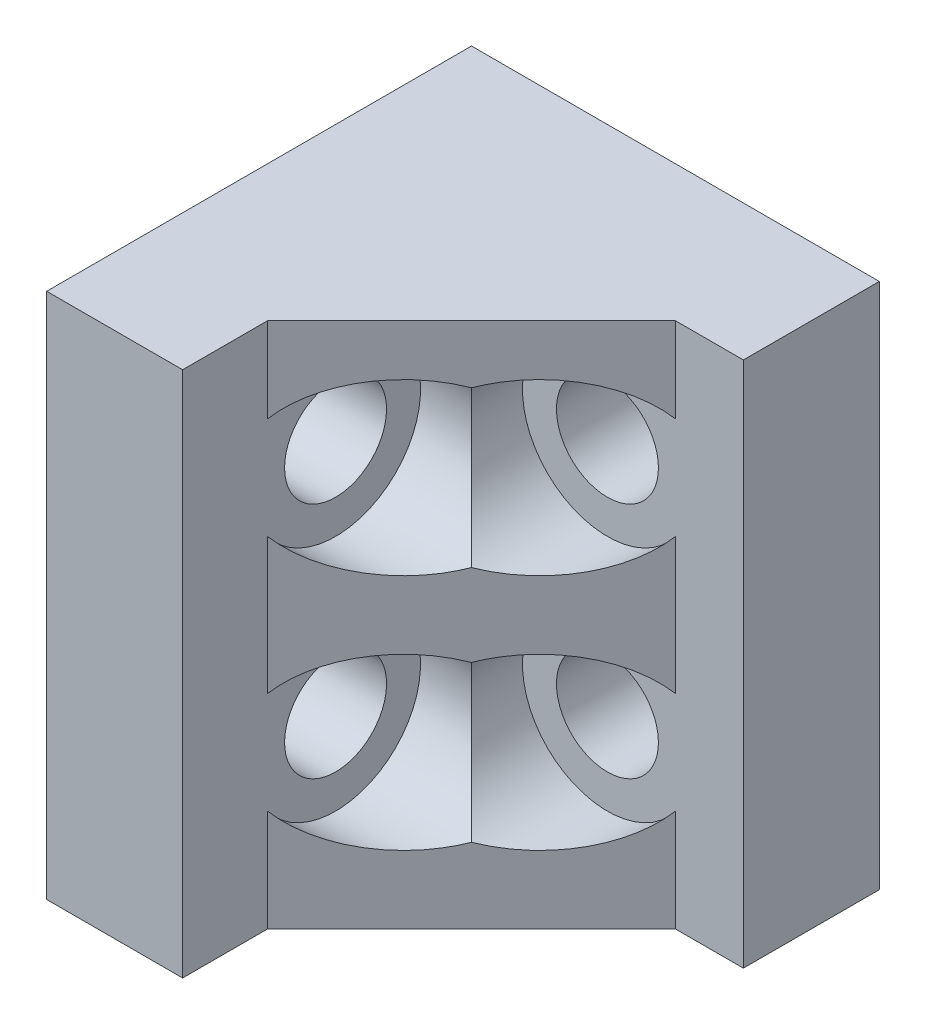
ISO-10303-21;
HEADER;
FILE_DESCRIPTION(('STEP AP214'),'2;1');
FILE_NAME('part.step','',(''),(''),'','','');
FILE_SCHEMA(('AUTOMOTIVE_DESIGN { 1 0 10303 214 1 1 1 1 }'));
ENDSEC;
DATA;
#1=APPLICATION_CONTEXT('core data for automotive mechanical design processes');
#2=APPLICATION_PROTOCOL_DEFINITION('international standard','automotive_design',2000,#1);
#3=PRODUCT_CONTEXT('',#1,'mechanical');
#4=PRODUCT('Part','Part','',(#3));
#5=PRODUCT_RELATED_PRODUCT_CATEGORY('part','',(#4));
#6=PRODUCT_DEFINITION_FORMATION('','',#4);
#7=PRODUCT_DEFINITION_CONTEXT('part definition',#1,'design');
#8=PRODUCT_DEFINITION('design','',#6,#7);
#9=PRODUCT_DEFINITION_SHAPE('','',#8);
#10=(LENGTH_UNIT() NAMED_UNIT(*) SI_UNIT(.MILLI.,.METRE.));
#11=(NAMED_UNIT(*) PLANE_ANGLE_UNIT() SI_UNIT($,.RADIAN.));
#12=(NAMED_UNIT(*) SI_UNIT($,.STERADIAN.) SOLID_ANGLE_UNIT());
#13=UNCERTAINTY_MEASURE_WITH_UNIT(LENGTH_MEASURE(1.E-05),#10,'distance_accuracy_value','');
#14=(GEOMETRIC_REPRESENTATION_CONTEXT(3) GLOBAL_UNCERTAINTY_ASSIGNED_CONTEXT((#13)) GLOBAL_UNIT_ASSIGNED_CONTEXT((#10,
#11,#12)) REPRESENTATION_CONTEXT('',''));
#15=CARTESIAN_POINT('',(0.,0.,0.));
#16=DIRECTION('',(0.,0.,1.));
#17=DIRECTION('',(1.,0.,0.));
#18=AXIS2_PLACEMENT_3D('',#15,#16,#17);
#19=CARTESIAN_POINT('',(5.78038521638798,20.3469783539631,10.));
#20=DIRECTION('',(0.707106781186548,0.,0.707106781186548));
#21=DIRECTION('',(0.707106781186548,0.,-0.707106781186548));
#22=AXIS2_PLACEMENT_3D('',#19,#20,#21);
#23=PLANE('',#22);
#24=CARTESIAN_POINT('',(9.78038521638798,31.8469783539631,6.));
#25=DIRECTION('',(0.707106781186548,0.,0.707106781186548));
#26=DIRECTION('',(-0.707106781186548,0.,0.707106781186548));
#27=AXIS2_PLACEMENT_3D('',#24,#25,#26);
#28=ELLIPSE('',#27,3.53553390593274,2.5);
#29=CARTESIAN_POINT('',(8.78038521638798,29.5556905064852,7.));
#30=VERTEX_POINT('',#29);
#31=CARTESIAN_POINT('',(11.780385216388,30.3469783539631,4.));
#32=VERTEX_POINT('',#31);
#33=EDGE_CURVE('E128',#30,#32,#28,.T.);
#34=ORIENTED_EDGE('',*,*,#33,.F.);
#35=CARTESIAN_POINT('',(7.78038521638798,31.8469783539631,8.));
#36=DIRECTION('',(0.707106781186548,0.,0.707106781186548));
#37=DIRECTION('',(0.707106781186548,0.,-0.707106781186548));
#38=AXIS2_PLACEMENT_3D('',#35,#36,#37);
#39=ELLIPSE('',#38,3.53553390593274,2.5);
#40=CARTESIAN_POINT('',(5.78038521638798,30.3469783539631,10.));
#41=VERTEX_POINT('',#40);
#42=EDGE_CURVE('E179',#41,#30,#39,.T.);
#43=ORIENTED_EDGE('',*,*,#42,.F.);
#44=DIRECTION('',(0.,1.,0.));
#45=VECTOR('',#44,1.);
#46=CARTESIAN_POINT('',(5.78038521638798,20.3469783539631,10.));
#47=LINE('',#46,#45);
#48=CARTESIAN_POINT('',(5.78038521638798,26.3469783539631,10.));
#49=VERTEX_POINT('',#48);
#50=EDGE_CURVE('E154',#49,#41,#47,.T.);
#51=ORIENTED_EDGE('',*,*,#50,.F.);
#52=CARTESIAN_POINT('',(7.78038521638798,24.8469783539631,8.));
#53=DIRECTION('',(0.707106781186548,0.,0.707106781186548));
#54=DIRECTION('',(0.707106781186548,0.,-0.707106781186548));
#55=AXIS2_PLACEMENT_3D('',#52,#53,#54);
#56=ELLIPSE('',#55,3.53553390593273,2.5);
#57=CARTESIAN_POINT('',(8.78038521638798,27.138266201441,7.));
#58=VERTEX_POINT('',#57);
#59=EDGE_CURVE('E178',#58,#49,#56,.T.);
#60=ORIENTED_EDGE('',*,*,#59,.F.);
#61=CARTESIAN_POINT('',(9.78038521638798,24.8469783539631,6.));
#62=DIRECTION('',(0.707106781186548,0.,0.707106781186548));
#63=DIRECTION('',(-0.707106781186548,0.,0.707106781186548));
#64=AXIS2_PLACEMENT_3D('',#61,#62,#63);
#65=ELLIPSE('',#64,3.53553390593274,2.5);
#66=CARTESIAN_POINT('',(11.780385216388,26.3469783539631,4.));
#67=VERTEX_POINT('',#66);
#68=EDGE_CURVE('E48',#67,#58,#65,.T.);
#69=ORIENTED_EDGE('',*,*,#68,.F.);
#70=DIRECTION('',(0.,1.,0.));
#71=VECTOR('',#70,1.);
#72=CARTESIAN_POINT('',(11.780385216388,20.3469783539631,4.));
#73=LINE('',#72,#71);
#74=EDGE_CURVE('E149',#67,#32,#73,.T.);
#75=ORIENTED_EDGE('',*,*,#74,.T.);
#76=EDGE_LOOP('',(#34,#43,#51,#60,#69,#75));
#77=FACE_BOUND('',#76,.T.);
#78=ADVANCED_FACE('F33',(#77),#23,.T.);
#79=CARTESIAN_POINT('',(8.78038521638798,22.5556905064852,7.));
#80=VERTEX_POINT('',#79);
#81=CARTESIAN_POINT('',(11.780385216388,23.3469783539631,4.));
#82=VERTEX_POINT('',#81);
#83=EDGE_CURVE('E188',#80,#82,#65,.T.);
#84=ORIENTED_EDGE('',*,*,#83,.F.);
#85=CARTESIAN_POINT('',(5.78038521638798,23.3469783539631,10.));
#86=VERTEX_POINT('',#85);
#87=EDGE_CURVE('E175',#86,#80,#56,.T.);
#88=ORIENTED_EDGE('',*,*,#87,.F.);
#89=CARTESIAN_POINT('',(5.78038521638798,20.3469783539631,10.));
#90=VERTEX_POINT('',#89);
#91=EDGE_CURVE('E150',#90,#86,#47,.T.);
#92=ORIENTED_EDGE('',*,*,#91,.F.);
#93=DIRECTION('',(0.707106781186548,0.,-0.707106781186548));
#94=VECTOR('',#93,1.);
#95=CARTESIAN_POINT('',(5.78038521638798,20.3469783539631,10.));
#96=LINE('',#95,#94);
#97=CARTESIAN_POINT('',(11.780385216388,20.3469783539631,4.));
#98=VERTEX_POINT('',#97);
#99=EDGE_CURVE('E199',#90,#98,#96,.T.);
#100=ORIENTED_EDGE('',*,*,#99,.T.);
#101=EDGE_CURVE('E152',#98,#82,#73,.T.);
#102=ORIENTED_EDGE('',*,*,#101,.T.);
#103=EDGE_LOOP('',(#84,#88,#92,#100,#102));
#104=FACE_BOUND('',#103,.T.);
#105=ADVANCED_FACE('F290',(#104),#23,.T.);
#106=CARTESIAN_POINT('',(1.78038521638798,35.8469783539631,4.));
#107=DIRECTION('',(1.,0.,0.));
#108=DIRECTION('',(0.,1.,0.));
#109=AXIS2_PLACEMENT_3D('',#106,#107,#108);
#110=PLANE('',#109);
#111=CARTESIAN_POINT('',(1.78038521638798,24.8469783539631,8.));
#112=DIRECTION('',(1.,0.,0.));
#113=DIRECTION('',(0.,1.,0.));
#114=AXIS2_PLACEMENT_3D('',#111,#112,#113);
#115=CIRCLE('',#114,1.5);
#116=CARTESIAN_POINT('',(1.78038521638798,26.3469783539631,8.));
#117=VERTEX_POINT('',#116);
#118=EDGE_CURVE('E214',#117,#117,#115,.T.);
#119=ORIENTED_EDGE('',*,*,#118,.T.);
#120=EDGE_LOOP('',(#119));
#121=FACE_BOUND('',#120,.T.);
#122=CARTESIAN_POINT('',(1.78038521638798,31.8469783539631,8.));
#123=DIRECTION('',(1.,0.,0.));
#124=DIRECTION('',(0.,1.,0.));
#125=AXIS2_PLACEMENT_3D('',#122,#123,#124);
#126=CIRCLE('',#125,1.5);
#127=CARTESIAN_POINT('',(1.78038521638798,33.3469783539631,8.));
#128=VERTEX_POINT('',#127);
#129=EDGE_CURVE('E169',#128,#128,#126,.T.);
#130=ORIENTED_EDGE('',*,*,#129,.T.);
#131=EDGE_LOOP('',(#130));
#132=FACE_BOUND('',#131,.T.);
#133=DIRECTION('',(0.,-1.,0.));
#134=VECTOR('',#133,1.);
#135=CARTESIAN_POINT('',(1.78038521638798,35.8469783539631,0.));
#136=LINE('',#135,#134);
#137=CARTESIAN_POINT('',(1.78038521638798,35.8469783539631,0.));
#138=VERTEX_POINT('',#137);
#139=CARTESIAN_POINT('',(1.78038521638798,20.3469783539631,0.));
#140=VERTEX_POINT('',#139);
#141=EDGE_CURVE('E232',#138,#140,#136,.T.);
#142=ORIENTED_EDGE('',*,*,#141,.T.);
#143=DIRECTION('',(0.,0.,-1.));
#144=VECTOR('',#143,1.);
#145=CARTESIAN_POINT('',(1.78038521638798,20.3469783539631,4.));
#146=LINE('',#145,#144);
#147=CARTESIAN_POINT('',(1.78038521638798,20.3469783539631,12.5));
#148=VERTEX_POINT('',#147);
#149=EDGE_CURVE('E172',#148,#140,#146,.T.);
#150=ORIENTED_EDGE('',*,*,#149,.F.);
#151=DIRECTION('',(0.,-1.,0.));
#152=VECTOR('',#151,1.);
#153=CARTESIAN_POINT('',(1.78038521638798,20.3469783539631,12.5));
#154=LINE('',#153,#152);
#155=CARTESIAN_POINT('',(1.78038521638798,35.8469783539631,12.5));
#156=VERTEX_POINT('',#155);
#157=EDGE_CURVE('E217',#156,#148,#154,.T.);
#158=ORIENTED_EDGE('',*,*,#157,.F.);
#159=DIRECTION('',(0.,0.,-1.));
#160=VECTOR('',#159,1.);
#161=CARTESIAN_POINT('',(1.78038521638798,35.8469783539631,4.));
#162=LINE('',#161,#160);
#163=EDGE_CURVE('E239',#156,#138,#162,.T.);
#164=ORIENTED_EDGE('',*,*,#163,.T.);
#165=EDGE_LOOP('',(#142,#150,#158,#164));
#166=FACE_BOUND('',#165,.T.);
#167=ADVANCED_FACE('F35',(#121,#132,#166),#110,.F.);
#168=CARTESIAN_POINT('',(1.78038521638798,20.3469783539631,4.));
#169=DIRECTION('',(0.,1.,0.));
#170=DIRECTION('',(0.,0.,1.));
#171=AXIS2_PLACEMENT_3D('',#168,#169,#170);
#172=PLANE('',#171);
#173=DIRECTION('',(1.,0.,0.));
#174=VECTOR('',#173,1.);
#175=CARTESIAN_POINT('',(1.78038521638798,20.3469783539631,4.));
#176=LINE('',#175,#174);
#177=CARTESIAN_POINT('',(13.780385216388,20.3469783539631,4.));
#178=VERTEX_POINT('',#177);
#179=EDGE_CURVE('E233',#98,#178,#176,.T.);
#180=ORIENTED_EDGE('',*,*,#179,.F.);
#181=ORIENTED_EDGE('',*,*,#99,.F.);
#182=DIRECTION('',(0.,0.,-1.));
#183=VECTOR('',#182,1.);
#184=CARTESIAN_POINT('',(5.78038521638798,20.3469783539631,12.5));
#185=LINE('',#184,#183);
#186=CARTESIAN_POINT('',(5.78038521638798,20.3469783539631,12.5));
#187=VERTEX_POINT('',#186);
#188=EDGE_CURVE('E229',#187,#90,#185,.T.);
#189=ORIENTED_EDGE('',*,*,#188,.F.);
#190=DIRECTION('',(1.,0.,0.));
#191=VECTOR('',#190,1.);
#192=CARTESIAN_POINT('',(1.78038521638798,20.3469783539631,12.5));
#193=LINE('',#192,#191);
#194=EDGE_CURVE('E220',#148,#187,#193,.T.);
#195=ORIENTED_EDGE('',*,*,#194,.F.);
#196=ORIENTED_EDGE('',*,*,#149,.T.);
#197=DIRECTION('',(1.,0.,0.));
#198=VECTOR('',#197,1.);
#199=CARTESIAN_POINT('',(1.78038521638798,20.3469783539631,0.));
#200=LINE('',#199,#198);
#201=CARTESIAN_POINT('',(13.780385216388,20.3469783539631,0.));
#202=VERTEX_POINT('',#201);
#203=EDGE_CURVE('E242',#140,#202,#200,.T.);
#204=ORIENTED_EDGE('',*,*,#203,.T.);
#205=DIRECTION('',(0.,0.,-1.));
#206=VECTOR('',#205,1.);
#207=CARTESIAN_POINT('',(13.780385216388,20.3469783539631,4.));
#208=LINE('',#207,#206);
#209=EDGE_CURVE('E251',#178,#202,#208,.T.);
#210=ORIENTED_EDGE('',*,*,#209,.F.);
#211=EDGE_LOOP('',(#180,#181,#189,#195,#196,#204,#210));
#212=FACE_BOUND('',#211,.T.);
#213=ADVANCED_FACE('F356',(#212),#172,.F.);
#214=CARTESIAN_POINT('',(13.780385216388,35.8469783539631,4.));
#215=DIRECTION('',(-1.,0.,0.));
#216=DIRECTION('',(0.,-1.,0.));
#217=AXIS2_PLACEMENT_3D('',#214,#215,#216);
#218=PLANE('',#217);
#219=DIRECTION('',(0.,1.,0.));
#220=VECTOR('',#219,1.);
#221=CARTESIAN_POINT('',(13.780385216388,35.8469783539631,0.));
#222=LINE('',#221,#220);
#223=CARTESIAN_POINT('',(13.780385216388,35.8469783539631,0.));
#224=VERTEX_POINT('',#223);
#225=EDGE_CURVE('E244',#202,#224,#222,.T.);
#226=ORIENTED_EDGE('',*,*,#225,.T.);
#227=DIRECTION('',(0.,0.,-1.));
#228=VECTOR('',#227,1.);
#229=CARTESIAN_POINT('',(13.780385216388,35.8469783539631,4.));
#230=LINE('',#229,#228);
#231=CARTESIAN_POINT('',(13.780385216388,35.8469783539631,4.));
#232=VERTEX_POINT('',#231);
#233=EDGE_CURVE('E249',#232,#224,#230,.T.);
#234=ORIENTED_EDGE('',*,*,#233,.F.);
#235=DIRECTION('',(0.,1.,0.));
#236=VECTOR('',#235,1.);
#237=CARTESIAN_POINT('',(13.780385216388,35.8469783539631,4.));
#238=LINE('',#237,#236);
#239=EDGE_CURVE('E235',#178,#232,#238,.T.);
#240=ORIENTED_EDGE('',*,*,#239,.F.);
#241=ORIENTED_EDGE('',*,*,#209,.T.);
#242=EDGE_LOOP('',(#226,#234,#240,#241));
#243=FACE_BOUND('',#242,.T.);
#244=ADVANCED_FACE('F286',(#243),#218,.F.);
#245=CARTESIAN_POINT('',(1.78038521638798,35.8469783539631,4.));
#246=DIRECTION('',(0.,-1.,0.));
#247=DIRECTION('',(0.,0.,-1.));
#248=AXIS2_PLACEMENT_3D('',#245,#246,#247);
#249=PLANE('',#248);
#250=DIRECTION('',(-1.,0.,0.));
#251=VECTOR('',#250,1.);
#252=CARTESIAN_POINT('',(1.78038521638798,35.8469783539631,0.));
#253=LINE('',#252,#251);
#254=EDGE_CURVE('E236',#224,#138,#253,.T.);
#255=ORIENTED_EDGE('',*,*,#254,.T.);
#256=ORIENTED_EDGE('',*,*,#163,.F.);
#257=DIRECTION('',(-1.,0.,0.));
#258=VECTOR('',#257,1.);
#259=CARTESIAN_POINT('',(1.78038521638798,35.8469783539631,12.5));
#260=LINE('',#259,#258);
#261=CARTESIAN_POINT('',(5.78038521638798,35.8469783539631,12.5));
#262=VERTEX_POINT('',#261);
#263=EDGE_CURVE('E224',#262,#156,#260,.T.);
#264=ORIENTED_EDGE('',*,*,#263,.F.);
#265=DIRECTION('',(0.,0.,-1.));
#266=VECTOR('',#265,1.);
#267=CARTESIAN_POINT('',(5.78038521638798,35.8469783539631,12.5));
#268=LINE('',#267,#266);
#269=CARTESIAN_POINT('',(5.78038521638798,35.8469783539631,10.));
#270=VERTEX_POINT('',#269);
#271=EDGE_CURVE('E227',#262,#270,#268,.T.);
#272=ORIENTED_EDGE('',*,*,#271,.T.);
#273=DIRECTION('',(0.707106781186548,0.,-0.707106781186548));
#274=VECTOR('',#273,1.);
#275=CARTESIAN_POINT('',(5.78038521638798,35.8469783539631,10.));
#276=LINE('',#275,#274);
#277=CARTESIAN_POINT('',(11.780385216388,35.8469783539631,4.));
#278=VERTEX_POINT('',#277);
#279=EDGE_CURVE('E200',#270,#278,#276,.T.);
#280=ORIENTED_EDGE('',*,*,#279,.T.);
#281=DIRECTION('',(-1.,0.,0.));
#282=VECTOR('',#281,1.);
#283=CARTESIAN_POINT('',(1.78038521638798,35.8469783539631,4.));
#284=LINE('',#283,#282);
#285=EDGE_CURVE('E148',#232,#278,#284,.T.);
#286=ORIENTED_EDGE('',*,*,#285,.F.);
#287=ORIENTED_EDGE('',*,*,#233,.T.);
#288=EDGE_LOOP('',(#255,#256,#264,#272,#280,#286,#287));
#289=FACE_BOUND('',#288,.T.);
#290=ADVANCED_FACE('F278',(#289),#249,.F.);
#291=CARTESIAN_POINT('',(0.,0.,4.));
#292=DIRECTION('',(0.,0.,1.));
#293=DIRECTION('',(1.,0.,0.));
#294=AXIS2_PLACEMENT_3D('',#291,#292,#293);
#295=PLANE('',#294);
#296=CARTESIAN_POINT('',(11.780385216388,33.3469783539631,4.));
#297=VERTEX_POINT('',#296);
#298=EDGE_CURVE('E139',#297,#278,#73,.T.);
#299=ORIENTED_EDGE('',*,*,#298,.F.);
#300=CARTESIAN_POINT('',(9.78038521638798,31.8469783539631,4.));
#301=DIRECTION('',(0.,0.,1.));
#302=DIRECTION('',(1.,0.,0.));
#303=AXIS2_PLACEMENT_3D('',#300,#301,#302);
#304=CIRCLE('',#303,2.5);
#305=EDGE_CURVE('E125',#297,#32,#304,.T.);
#306=ORIENTED_EDGE('',*,*,#305,.T.);
#307=ORIENTED_EDGE('',*,*,#74,.F.);
#308=CARTESIAN_POINT('',(9.78038521638798,24.8469783539631,4.));
#309=DIRECTION('',(0.,0.,1.));
#310=DIRECTION('',(1.,0.,0.));
#311=AXIS2_PLACEMENT_3D('',#308,#309,#310);
#312=CIRCLE('',#311,2.5);
#313=EDGE_CURVE('E133',#67,#82,#312,.T.);
#314=ORIENTED_EDGE('',*,*,#313,.T.);
#315=ORIENTED_EDGE('',*,*,#101,.F.);
#316=ORIENTED_EDGE('',*,*,#179,.T.);
#317=ORIENTED_EDGE('',*,*,#239,.T.);
#318=ORIENTED_EDGE('',*,*,#285,.T.);
#319=EDGE_LOOP('',(#299,#306,#307,#314,#315,#316,#317,#318));
#320=FACE_BOUND('',#319,.T.);
#321=CARTESIAN_POINT('',(9.78038521638798,24.8469783539631,4.));
#322=DIRECTION('',(0.,0.,-1.));
#323=DIRECTION('',(-1.,0.,0.));
#324=AXIS2_PLACEMENT_3D('',#321,#322,#323);
#325=CIRCLE('',#324,1.5);
#326=CARTESIAN_POINT('',(8.28038521638798,24.8469783539631,4.));
#327=VERTEX_POINT('',#326);
#328=EDGE_CURVE('E268',#327,#327,#325,.F.);
#329=ORIENTED_EDGE('',*,*,#328,.F.);
#330=EDGE_LOOP('',(#329));
#331=FACE_BOUND('',#330,.T.);
#332=CARTESIAN_POINT('',(9.78038521638798,31.8469783539631,4.));
#333=DIRECTION('',(0.,0.,-1.));
#334=DIRECTION('',(-1.,0.,0.));
#335=AXIS2_PLACEMENT_3D('',#332,#333,#334);
#336=CIRCLE('',#335,1.5);
#337=CARTESIAN_POINT('',(8.28038521638797,31.8469783539631,4.));
#338=VERTEX_POINT('',#337);
#339=EDGE_CURVE('E198',#338,#338,#336,.F.);
#340=ORIENTED_EDGE('',*,*,#339,.F.);
#341=EDGE_LOOP('',(#340));
#342=FACE_BOUND('',#341,.T.);
#343=ADVANCED_FACE('F145',(#320,#331,#342),#295,.T.);
#344=CARTESIAN_POINT('',(0.,0.,0.));
#345=DIRECTION('',(0.,0.,1.));
#346=DIRECTION('',(1.,0.,0.));
#347=AXIS2_PLACEMENT_3D('',#344,#345,#346);
#348=PLANE('',#347);
#349=CARTESIAN_POINT('',(9.78038521638798,24.8469783539631,0.));
#350=DIRECTION('',(0.,0.,1.));
#351=DIRECTION('',(1.,0.,0.));
#352=AXIS2_PLACEMENT_3D('',#349,#350,#351);
#353=CIRCLE('',#352,1.5);
#354=CARTESIAN_POINT('',(11.280385216388,24.8469783539631,0.));
#355=VERTEX_POINT('',#354);
#356=EDGE_CURVE('E164',#355,#355,#353,.T.);
#357=ORIENTED_EDGE('',*,*,#356,.T.);
#358=EDGE_LOOP('',(#357));
#359=FACE_BOUND('',#358,.T.);
#360=CARTESIAN_POINT('',(9.78038521638798,31.8469783539631,0.));
#361=DIRECTION('',(0.,0.,1.));
#362=DIRECTION('',(1.,0.,0.));
#363=AXIS2_PLACEMENT_3D('',#360,#361,#362);
#364=CIRCLE('',#363,1.5);
#365=CARTESIAN_POINT('',(11.280385216388,31.8469783539631,0.));
#366=VERTEX_POINT('',#365);
#367=EDGE_CURVE('E159',#366,#366,#364,.T.);
#368=ORIENTED_EDGE('',*,*,#367,.T.);
#369=EDGE_LOOP('',(#368));
#370=FACE_BOUND('',#369,.T.);
#371=ORIENTED_EDGE('',*,*,#141,.F.);
#372=ORIENTED_EDGE('',*,*,#254,.F.);
#373=ORIENTED_EDGE('',*,*,#225,.F.);
#374=ORIENTED_EDGE('',*,*,#203,.F.);
#375=EDGE_LOOP('',(#371,#372,#373,#374));
#376=FACE_BOUND('',#375,.T.);
#377=ADVANCED_FACE('F277',(#359,#370,#376),#348,.F.);
#378=CARTESIAN_POINT('',(5.78038521638798,20.3469783539631,12.5));
#379=DIRECTION('',(-1.,0.,0.));
#380=DIRECTION('',(0.,0.,1.));
#381=AXIS2_PLACEMENT_3D('',#378,#379,#380);
#382=PLANE('',#381);
#383=ORIENTED_EDGE('',*,*,#50,.T.);
#384=CARTESIAN_POINT('',(5.78038521638798,31.8469783539631,8.));
#385=DIRECTION('',(1.,0.,0.));
#386=DIRECTION('',(0.,1.,0.));
#387=AXIS2_PLACEMENT_3D('',#384,#385,#386);
#388=CIRCLE('',#387,2.5);
#389=CARTESIAN_POINT('',(5.78038521638798,33.3469783539631,10.));
#390=VERTEX_POINT('',#389);
#391=EDGE_CURVE('E192',#41,#390,#388,.T.);
#392=ORIENTED_EDGE('',*,*,#391,.T.);
#393=EDGE_CURVE('E156',#390,#270,#47,.T.);
#394=ORIENTED_EDGE('',*,*,#393,.T.);
#395=ORIENTED_EDGE('',*,*,#271,.F.);
#396=DIRECTION('',(0.,1.,0.));
#397=VECTOR('',#396,1.);
#398=CARTESIAN_POINT('',(5.78038521638798,20.3469783539631,12.5));
#399=LINE('',#398,#397);
#400=EDGE_CURVE('E222',#187,#262,#399,.T.);
#401=ORIENTED_EDGE('',*,*,#400,.F.);
#402=ORIENTED_EDGE('',*,*,#188,.T.);
#403=ORIENTED_EDGE('',*,*,#91,.T.);
#404=CARTESIAN_POINT('',(5.78038521638798,24.8469783539631,8.));
#405=DIRECTION('',(1.,0.,0.));
#406=DIRECTION('',(0.,1.,0.));
#407=AXIS2_PLACEMENT_3D('',#404,#405,#406);
#408=CIRCLE('',#407,2.5);
#409=EDGE_CURVE('E195',#86,#49,#408,.T.);
#410=ORIENTED_EDGE('',*,*,#409,.T.);
#411=EDGE_LOOP('',(#383,#392,#394,#395,#401,#402,#403,#410));
#412=FACE_BOUND('',#411,.T.);
#413=CARTESIAN_POINT('',(5.78038521638798,24.8469783539631,8.));
#414=DIRECTION('',(-1.,0.,0.));
#415=DIRECTION('',(0.,0.,1.));
#416=AXIS2_PLACEMENT_3D('',#413,#414,#415);
#417=CIRCLE('',#416,1.5);
#418=CARTESIAN_POINT('',(5.78038521638798,24.8469783539631,9.5));
#419=VERTEX_POINT('',#418);
#420=EDGE_CURVE('E194',#419,#419,#417,.F.);
#421=ORIENTED_EDGE('',*,*,#420,.F.);
#422=EDGE_LOOP('',(#421));
#423=FACE_BOUND('',#422,.T.);
#424=CARTESIAN_POINT('',(5.78038521638798,31.8469783539631,8.));
#425=DIRECTION('',(-1.,0.,0.));
#426=DIRECTION('',(0.,0.,1.));
#427=AXIS2_PLACEMENT_3D('',#424,#425,#426);
#428=CIRCLE('',#427,1.5);
#429=CARTESIAN_POINT('',(5.78038521638798,31.8469783539631,9.5));
#430=VERTEX_POINT('',#429);
#431=EDGE_CURVE('E201',#430,#430,#428,.F.);
#432=ORIENTED_EDGE('',*,*,#431,.F.);
#433=EDGE_LOOP('',(#432));
#434=FACE_BOUND('',#433,.T.);
#435=ADVANCED_FACE('F265',(#412,#423,#434),#382,.F.);
#436=CARTESIAN_POINT('',(0.,0.,12.5));
#437=DIRECTION('',(0.,0.,-1.));
#438=DIRECTION('',(-1.,0.,0.));
#439=AXIS2_PLACEMENT_3D('',#436,#437,#438);
#440=PLANE('',#439);
#441=ORIENTED_EDGE('',*,*,#157,.T.);
#442=ORIENTED_EDGE('',*,*,#194,.T.);
#443=ORIENTED_EDGE('',*,*,#400,.T.);
#444=ORIENTED_EDGE('',*,*,#263,.T.);
#445=EDGE_LOOP('',(#441,#442,#443,#444));
#446=FACE_BOUND('',#445,.T.);
#447=ADVANCED_FACE('F317',(#446),#440,.F.);
#448=CARTESIAN_POINT('',(0.780385216387978,31.8469783539631,8.));
#449=DIRECTION('',(1.,0.,0.));
#450=DIRECTION('',(0.,0.,-1.));
#451=AXIS2_PLACEMENT_3D('',#448,#449,#450);
#452=CYLINDRICAL_SURFACE('',#451,1.5);
#453=ORIENTED_EDGE('',*,*,#431,.T.);
#454=EDGE_LOOP('',(#453));
#455=FACE_BOUND('',#454,.T.);
#456=ORIENTED_EDGE('',*,*,#129,.F.);
#457=EDGE_LOOP('',(#456));
#458=FACE_BOUND('',#457,.T.);
#459=ADVANCED_FACE('F313',(#455,#458),#452,.F.);
#460=CARTESIAN_POINT('',(0.780385216387978,24.8469783539631,8.));
#461=DIRECTION('',(1.,0.,0.));
#462=DIRECTION('',(0.,0.,-1.));
#463=AXIS2_PLACEMENT_3D('',#460,#461,#462);
#464=CYLINDRICAL_SURFACE('',#463,1.5);
#465=ORIENTED_EDGE('',*,*,#420,.T.);
#466=EDGE_LOOP('',(#465));
#467=FACE_BOUND('',#466,.T.);
#468=ORIENTED_EDGE('',*,*,#118,.F.);
#469=EDGE_LOOP('',(#468));
#470=FACE_BOUND('',#469,.T.);
#471=ADVANCED_FACE('F307',(#467,#470),#464,.F.);
#472=CARTESIAN_POINT('',(9.78038521638798,31.8469783539631,-1.));
#473=DIRECTION('',(0.,0.,1.));
#474=DIRECTION('',(1.,0.,0.));
#475=AXIS2_PLACEMENT_3D('',#472,#473,#474);
#476=CYLINDRICAL_SURFACE('',#475,1.5);
#477=ORIENTED_EDGE('',*,*,#339,.T.);
#478=EDGE_LOOP('',(#477));
#479=FACE_BOUND('',#478,.T.);
#480=ORIENTED_EDGE('',*,*,#367,.F.);
#481=EDGE_LOOP('',(#480));
#482=FACE_BOUND('',#481,.T.);
#483=ADVANCED_FACE('F273',(#479,#482),#476,.F.);
#484=CARTESIAN_POINT('',(9.78038521638798,24.8469783539631,-1.));
#485=DIRECTION('',(0.,0.,1.));
#486=DIRECTION('',(1.,0.,0.));
#487=AXIS2_PLACEMENT_3D('',#484,#485,#486);
#488=CYLINDRICAL_SURFACE('',#487,1.5);
#489=ORIENTED_EDGE('',*,*,#328,.T.);
#490=EDGE_LOOP('',(#489));
#491=FACE_BOUND('',#490,.T.);
#492=ORIENTED_EDGE('',*,*,#356,.F.);
#493=EDGE_LOOP('',(#492));
#494=FACE_BOUND('',#493,.T.);
#495=ADVANCED_FACE('F298',(#491,#494),#488,.F.);
#496=CARTESIAN_POINT('',(8.78038521638798,34.138266201441,7.));
#497=VERTEX_POINT('',#496);
#498=EDGE_CURVE('E55',#297,#497,#28,.T.);
#499=ORIENTED_EDGE('',*,*,#498,.F.);
#500=ORIENTED_EDGE('',*,*,#298,.T.);
#501=ORIENTED_EDGE('',*,*,#279,.F.);
#502=ORIENTED_EDGE('',*,*,#393,.F.);
#503=EDGE_CURVE('E142',#497,#390,#39,.T.);
#504=ORIENTED_EDGE('',*,*,#503,.F.);
#505=EDGE_LOOP('',(#499,#500,#501,#502,#504));
#506=FACE_BOUND('',#505,.T.);
#507=ADVANCED_FACE('F137',(#506),#23,.T.);
#508=CARTESIAN_POINT('',(5.78038521638798,24.8469783539631,8.));
#509=DIRECTION('',(1.,0.,0.));
#510=DIRECTION('',(0.,1.,0.));
#511=AXIS2_PLACEMENT_3D('',#508,#509,#510);
#512=CYLINDRICAL_SURFACE('',#511,2.5);
#513=ORIENTED_EDGE('',*,*,#87,.T.);
#514=CARTESIAN_POINT('',(9.78038521638798,24.8469783539631,8.));
#515=DIRECTION('',(0.707106781186547,0.,-0.707106781186547));
#516=DIRECTION('',(0.707106781186547,0.,0.707106781186547));
#517=AXIS2_PLACEMENT_3D('',#514,#515,#516);
#518=ELLIPSE('',#517,3.53553390593274,2.5);
#519=EDGE_CURVE('E11',#80,#58,#518,.T.);
#520=ORIENTED_EDGE('',*,*,#519,.T.);
#521=ORIENTED_EDGE('',*,*,#59,.T.);
#522=ORIENTED_EDGE('',*,*,#409,.F.);
#523=EDGE_LOOP('',(#513,#520,#521,#522));
#524=FACE_BOUND('',#523,.T.);
#525=ADVANCED_FACE('F262',(#524),#512,.F.);
#526=CARTESIAN_POINT('',(5.78038521638798,31.8469783539631,8.));
#527=DIRECTION('',(1.,0.,0.));
#528=DIRECTION('',(0.,1.,0.));
#529=AXIS2_PLACEMENT_3D('',#526,#527,#528);
#530=CYLINDRICAL_SURFACE('',#529,2.5);
#531=ORIENTED_EDGE('',*,*,#42,.T.);
#532=CARTESIAN_POINT('',(9.78038521638798,31.8469783539631,8.));
#533=DIRECTION('',(0.707106781186547,0.,-0.707106781186547));
#534=DIRECTION('',(0.707106781186547,0.,0.707106781186547));
#535=AXIS2_PLACEMENT_3D('',#532,#533,#534);
#536=ELLIPSE('',#535,3.53553390593274,2.5);
#537=EDGE_CURVE('E41',#30,#497,#536,.T.);
#538=ORIENTED_EDGE('',*,*,#537,.T.);
#539=ORIENTED_EDGE('',*,*,#503,.T.);
#540=ORIENTED_EDGE('',*,*,#391,.F.);
#541=EDGE_LOOP('',(#531,#538,#539,#540));
#542=FACE_BOUND('',#541,.T.);
#543=ADVANCED_FACE('F182',(#542),#530,.F.);
#544=CARTESIAN_POINT('',(9.78038521638798,31.8469783539631,4.));
#545=DIRECTION('',(0.,0.,1.));
#546=DIRECTION('',(1.,0.,0.));
#547=AXIS2_PLACEMENT_3D('',#544,#545,#546);
#548=CYLINDRICAL_SURFACE('',#547,2.5);
#549=ORIENTED_EDGE('',*,*,#33,.T.);
#550=ORIENTED_EDGE('',*,*,#305,.F.);
#551=ORIENTED_EDGE('',*,*,#498,.T.);
#552=ORIENTED_EDGE('',*,*,#537,.F.);
#553=EDGE_LOOP('',(#549,#550,#551,#552));
#554=FACE_BOUND('',#553,.T.);
#555=ADVANCED_FACE('F126',(#554),#548,.F.);
#556=CARTESIAN_POINT('',(9.78038521638798,24.8469783539631,4.));
#557=DIRECTION('',(0.,0.,1.));
#558=DIRECTION('',(1.,0.,0.));
#559=AXIS2_PLACEMENT_3D('',#556,#557,#558);
#560=CYLINDRICAL_SURFACE('',#559,2.5);
#561=ORIENTED_EDGE('',*,*,#83,.T.);
#562=ORIENTED_EDGE('',*,*,#313,.F.);
#563=ORIENTED_EDGE('',*,*,#68,.T.);
#564=ORIENTED_EDGE('',*,*,#519,.F.);
#565=EDGE_LOOP('',(#561,#562,#563,#564));
#566=FACE_BOUND('',#565,.T.);
#567=ADVANCED_FACE('F437',(#566),#560,.F.);
#568=CLOSED_SHELL('',(#78,#105,#167,#213,#244,#290,#343,#377,#435,#447,#459,#471,#483,#495,#507,
#525,#543,#555,#567));
#569=MANIFOLD_SOLID_BREP('B2',#568);
#570=ADVANCED_BREP_SHAPE_REPRESENTATION('',(#18,#569),#14);
#571=SHAPE_DEFINITION_REPRESENTATION(#9,#570);
ENDSEC;
END-ISO-10303-21;
